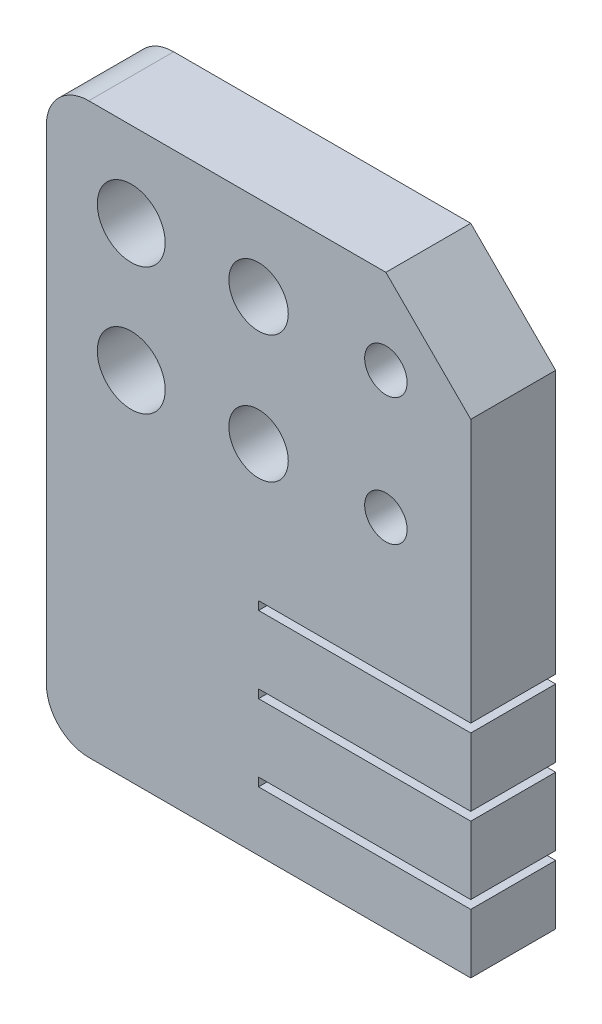
ISO-10303-21;
HEADER;
FILE_DESCRIPTION(('STEP AP214'),'2;1');
FILE_NAME('part.step','',(''),(''),'','','');
FILE_SCHEMA(('AUTOMOTIVE_DESIGN { 1 0 10303 214 1 1 1 1 }'));
ENDSEC;
DATA;
#1=APPLICATION_CONTEXT('core data for automotive mechanical design processes');
#2=APPLICATION_PROTOCOL_DEFINITION('international standard','automotive_design',2000,#1);
#3=PRODUCT_CONTEXT('',#1,'mechanical');
#4=PRODUCT('Part','Part','',(#3));
#5=PRODUCT_RELATED_PRODUCT_CATEGORY('part','',(#4));
#6=PRODUCT_DEFINITION_FORMATION('','',#4);
#7=PRODUCT_DEFINITION_CONTEXT('part definition',#1,'design');
#8=PRODUCT_DEFINITION('design','',#6,#7);
#9=PRODUCT_DEFINITION_SHAPE('','',#8);
#10=(LENGTH_UNIT() NAMED_UNIT(*) SI_UNIT(.MILLI.,.METRE.));
#11=(NAMED_UNIT(*) PLANE_ANGLE_UNIT() SI_UNIT($,.RADIAN.));
#12=(NAMED_UNIT(*) SI_UNIT($,.STERADIAN.) SOLID_ANGLE_UNIT());
#13=UNCERTAINTY_MEASURE_WITH_UNIT(LENGTH_MEASURE(1.E-05),#10,'distance_accuracy_value','');
#14=(GEOMETRIC_REPRESENTATION_CONTEXT(3) GLOBAL_UNCERTAINTY_ASSIGNED_CONTEXT((#13)) GLOBAL_UNIT_ASSIGNED_CONTEXT((#10,
#11,#12)) REPRESENTATION_CONTEXT('',''));
#15=CARTESIAN_POINT('',(0.,0.,0.));
#16=DIRECTION('',(0.,0.,1.));
#17=DIRECTION('',(1.,0.,0.));
#18=AXIS2_PLACEMENT_3D('',#15,#16,#17);
#19=CARTESIAN_POINT('',(50.,0.,10.));
#20=DIRECTION('',(-1.,0.,0.));
#21=DIRECTION('',(0.,0.,1.));
#22=AXIS2_PLACEMENT_3D('',#19,#20,#21);
#23=PLANE('',#22);
#24=DIRECTION('',(0.,1.,0.));
#25=VECTOR('',#24,1.);
#26=CARTESIAN_POINT('',(50.,0.,10.));
#27=LINE('',#26,#25);
#28=CARTESIAN_POINT('',(50.,26.,10.));
#29=VERTEX_POINT('',#28);
#30=CARTESIAN_POINT('',(50.,57.,10.));
#31=VERTEX_POINT('',#30);
#32=EDGE_CURVE('E340',#29,#31,#27,.T.);
#33=ORIENTED_EDGE('',*,*,#32,.F.);
#34=DIRECTION('',(0.,0.,1.));
#35=VECTOR('',#34,1.);
#36=CARTESIAN_POINT('',(50.,26.,-25.0199920063936));
#37=LINE('',#36,#35);
#38=CARTESIAN_POINT('',(50.,26.,0.));
#39=VERTEX_POINT('',#38);
#40=EDGE_CURVE('E211',#39,#29,#37,.T.);
#41=ORIENTED_EDGE('',*,*,#40,.F.);
#42=DIRECTION('',(0.,1.,0.));
#43=VECTOR('',#42,1.);
#44=CARTESIAN_POINT('',(50.,0.,0.));
#45=LINE('',#44,#43);
#46=CARTESIAN_POINT('',(50.,57.,0.));
#47=VERTEX_POINT('',#46);
#48=EDGE_CURVE('E196',#39,#47,#45,.T.);
#49=ORIENTED_EDGE('',*,*,#48,.T.);
#50=DIRECTION('',(0.,0.,-1.));
#51=VECTOR('',#50,1.);
#52=CARTESIAN_POINT('',(50.,57.,10.));
#53=LINE('',#52,#51);
#54=EDGE_CURVE('E11',#31,#47,#53,.T.);
#55=ORIENTED_EDGE('',*,*,#54,.F.);
#56=EDGE_LOOP('',(#33,#41,#49,#55));
#57=FACE_BOUND('',#56,.T.);
#58=ADVANCED_FACE('F39',(#57),#23,.F.);
#59=CARTESIAN_POINT('',(50.,17.,0.));
#60=VERTEX_POINT('',#59);
#61=CARTESIAN_POINT('',(50.,25.,0.));
#62=VERTEX_POINT('',#61);
#63=EDGE_CURVE('E431',#60,#62,#45,.T.);
#64=ORIENTED_EDGE('',*,*,#63,.T.);
#65=DIRECTION('',(0.,0.,1.));
#66=VECTOR('',#65,1.);
#67=CARTESIAN_POINT('',(50.,25.,-25.0199920063936));
#68=LINE('',#67,#66);
#69=CARTESIAN_POINT('',(50.,25.,10.));
#70=VERTEX_POINT('',#69);
#71=EDGE_CURVE('E207',#62,#70,#68,.T.);
#72=ORIENTED_EDGE('',*,*,#71,.T.);
#73=CARTESIAN_POINT('',(50.,17.,10.));
#74=VERTEX_POINT('',#73);
#75=EDGE_CURVE('E455',#74,#70,#27,.T.);
#76=ORIENTED_EDGE('',*,*,#75,.F.);
#77=DIRECTION('',(0.,0.,1.));
#78=VECTOR('',#77,1.);
#79=CARTESIAN_POINT('',(50.,17.,-25.0199920063936));
#80=LINE('',#79,#78);
#81=EDGE_CURVE('E245',#60,#74,#80,.T.);
#82=ORIENTED_EDGE('',*,*,#81,.F.);
#83=EDGE_LOOP('',(#64,#72,#76,#82));
#84=FACE_BOUND('',#83,.T.);
#85=ADVANCED_FACE('F460',(#84),#23,.F.);
#86=CARTESIAN_POINT('',(50.,8.,0.));
#87=VERTEX_POINT('',#86);
#88=CARTESIAN_POINT('',(50.,16.,0.));
#89=VERTEX_POINT('',#88);
#90=EDGE_CURVE('E364',#87,#89,#45,.T.);
#91=ORIENTED_EDGE('',*,*,#90,.T.);
#92=DIRECTION('',(0.,0.,1.));
#93=VECTOR('',#92,1.);
#94=CARTESIAN_POINT('',(50.,16.,-25.0199920063936));
#95=LINE('',#94,#93);
#96=CARTESIAN_POINT('',(50.,16.,10.));
#97=VERTEX_POINT('',#96);
#98=EDGE_CURVE('E237',#89,#97,#95,.T.);
#99=ORIENTED_EDGE('',*,*,#98,.T.);
#100=CARTESIAN_POINT('',(50.,8.,10.));
#101=VERTEX_POINT('',#100);
#102=EDGE_CURVE('E339',#101,#97,#27,.T.);
#103=ORIENTED_EDGE('',*,*,#102,.F.);
#104=DIRECTION('',(0.,0.,1.));
#105=VECTOR('',#104,1.);
#106=CARTESIAN_POINT('',(50.,8.,-25.0199920063936));
#107=LINE('',#106,#105);
#108=EDGE_CURVE('E228',#87,#101,#107,.T.);
#109=ORIENTED_EDGE('',*,*,#108,.F.);
#110=EDGE_LOOP('',(#91,#99,#103,#109));
#111=FACE_BOUND('',#110,.T.);
#112=ADVANCED_FACE('F442',(#111),#23,.F.);
#113=CARTESIAN_POINT('',(5.,62.,10.));
#114=DIRECTION('',(0.,0.,-1.));
#115=DIRECTION('',(-1.,0.,0.));
#116=AXIS2_PLACEMENT_3D('',#113,#114,#115);
#117=PLANE('',#116);
#118=DIRECTION('',(0.,-1.,0.));
#119=VECTOR('',#118,1.);
#120=CARTESIAN_POINT('',(25.,26.,10.));
#121=LINE('',#120,#119);
#122=CARTESIAN_POINT('',(25.,26.,10.));
#123=VERTEX_POINT('',#122);
#124=CARTESIAN_POINT('',(25.,25.,10.));
#125=VERTEX_POINT('',#124);
#126=EDGE_CURVE('E200',#123,#125,#121,.T.);
#127=ORIENTED_EDGE('',*,*,#126,.F.);
#128=DIRECTION('',(-1.,0.,0.));
#129=VECTOR('',#128,1.);
#130=CARTESIAN_POINT('',(50.,26.,10.));
#131=LINE('',#130,#129);
#132=EDGE_CURVE('E188',#29,#123,#131,.T.);
#133=ORIENTED_EDGE('',*,*,#132,.F.);
#134=ORIENTED_EDGE('',*,*,#32,.T.);
#135=DIRECTION('',(-0.707106781186549,0.707106781186546,0.));
#136=VECTOR('',#135,1.);
#137=CARTESIAN_POINT('',(40.,67.,10.));
#138=LINE('',#137,#136);
#139=CARTESIAN_POINT('',(40.,67.,10.));
#140=VERTEX_POINT('',#139);
#141=EDGE_CURVE('E338',#31,#140,#138,.T.);
#142=ORIENTED_EDGE('',*,*,#141,.T.);
#143=DIRECTION('',(-1.,0.,0.));
#144=VECTOR('',#143,1.);
#145=CARTESIAN_POINT('',(5.00000000000004,67.,10.));
#146=LINE('',#145,#144);
#147=CARTESIAN_POINT('',(5.00000000000003,67.,10.));
#148=VERTEX_POINT('',#147);
#149=EDGE_CURVE('E343',#140,#148,#146,.T.);
#150=ORIENTED_EDGE('',*,*,#149,.T.);
#151=CARTESIAN_POINT('',(5.,62.,10.));
#152=DIRECTION('',(0.,0.,1.));
#153=DIRECTION('',(-1.,0.,0.));
#154=AXIS2_PLACEMENT_3D('',#151,#152,#153);
#155=CIRCLE('',#154,5.);
#156=CARTESIAN_POINT('',(0.,62.,10.));
#157=VERTEX_POINT('',#156);
#158=EDGE_CURVE('E346',#148,#157,#155,.T.);
#159=ORIENTED_EDGE('',*,*,#158,.T.);
#160=DIRECTION('',(0.,-1.,0.));
#161=VECTOR('',#160,1.);
#162=CARTESIAN_POINT('',(0.,5.00000000000004,10.));
#163=LINE('',#162,#161);
#164=CARTESIAN_POINT('',(0.,5.,10.));
#165=VERTEX_POINT('',#164);
#166=EDGE_CURVE('E349',#157,#165,#163,.T.);
#167=ORIENTED_EDGE('',*,*,#166,.T.);
#168=CARTESIAN_POINT('',(5.,5.,10.));
#169=DIRECTION('',(0.,0.,1.));
#170=DIRECTION('',(-1.,0.,0.));
#171=AXIS2_PLACEMENT_3D('',#168,#169,#170);
#172=CIRCLE('',#171,5.);
#173=CARTESIAN_POINT('',(5.00000000000004,0.,10.));
#174=VERTEX_POINT('',#173);
#175=EDGE_CURVE('E352',#165,#174,#172,.T.);
#176=ORIENTED_EDGE('',*,*,#175,.T.);
#177=DIRECTION('',(1.,0.,0.));
#178=VECTOR('',#177,1.);
#179=CARTESIAN_POINT('',(5.00000000000004,0.,10.));
#180=LINE('',#179,#178);
#181=CARTESIAN_POINT('',(50.,0.,10.));
#182=VERTEX_POINT('',#181);
#183=EDGE_CURVE('E355',#174,#182,#180,.T.);
#184=ORIENTED_EDGE('',*,*,#183,.T.);
#185=CARTESIAN_POINT('',(50.,7.,10.));
#186=VERTEX_POINT('',#185);
#187=EDGE_CURVE('E334',#182,#186,#27,.T.);
#188=ORIENTED_EDGE('',*,*,#187,.T.);
#189=DIRECTION('',(1.,0.,0.));
#190=VECTOR('',#189,1.);
#191=CARTESIAN_POINT('',(25.,7.,10.));
#192=LINE('',#191,#190);
#193=CARTESIAN_POINT('',(25.,7.,10.));
#194=VERTEX_POINT('',#193);
#195=EDGE_CURVE('E252',#194,#186,#192,.T.);
#196=ORIENTED_EDGE('',*,*,#195,.F.);
#197=DIRECTION('',(0.,-1.,0.));
#198=VECTOR('',#197,1.);
#199=CARTESIAN_POINT('',(25.,8.,10.));
#200=LINE('',#199,#198);
#201=CARTESIAN_POINT('',(25.,8.,10.));
#202=VERTEX_POINT('',#201);
#203=EDGE_CURVE('E256',#202,#194,#200,.T.);
#204=ORIENTED_EDGE('',*,*,#203,.F.);
#205=DIRECTION('',(-1.,0.,0.));
#206=VECTOR('',#205,1.);
#207=CARTESIAN_POINT('',(50.,8.,10.));
#208=LINE('',#207,#206);
#209=EDGE_CURVE('E260',#101,#202,#208,.T.);
#210=ORIENTED_EDGE('',*,*,#209,.F.);
#211=ORIENTED_EDGE('',*,*,#102,.T.);
#212=DIRECTION('',(1.,0.,0.));
#213=VECTOR('',#212,1.);
#214=CARTESIAN_POINT('',(25.,16.,10.));
#215=LINE('',#214,#213);
#216=CARTESIAN_POINT('',(25.,16.,10.));
#217=VERTEX_POINT('',#216);
#218=EDGE_CURVE('E63',#217,#97,#215,.T.);
#219=ORIENTED_EDGE('',*,*,#218,.F.);
#220=DIRECTION('',(0.,-1.,0.));
#221=VECTOR('',#220,1.);
#222=CARTESIAN_POINT('',(25.,17.,10.));
#223=LINE('',#222,#221);
#224=CARTESIAN_POINT('',(25.,17.,10.));
#225=VERTEX_POINT('',#224);
#226=EDGE_CURVE('E220',#225,#217,#223,.T.);
#227=ORIENTED_EDGE('',*,*,#226,.F.);
#228=DIRECTION('',(-1.,0.,0.));
#229=VECTOR('',#228,1.);
#230=CARTESIAN_POINT('',(50.,17.,10.));
#231=LINE('',#230,#229);
#232=EDGE_CURVE('E224',#74,#225,#231,.T.);
#233=ORIENTED_EDGE('',*,*,#232,.F.);
#234=ORIENTED_EDGE('',*,*,#75,.T.);
#235=DIRECTION('',(1.,0.,0.));
#236=VECTOR('',#235,1.);
#237=CARTESIAN_POINT('',(25.,25.,10.));
#238=LINE('',#237,#236);
#239=EDGE_CURVE('E55',#125,#70,#238,.T.);
#240=ORIENTED_EDGE('',*,*,#239,.F.);
#241=EDGE_LOOP('',(#127,#133,#134,#142,#150,#159,#167,#176,#184,#188,#196,#204,#210,#211,#219,
#227,#233,#234,#240));
#242=FACE_BOUND('',#241,.T.);
#243=CARTESIAN_POINT('',(10.,57.,10.));
#244=DIRECTION('',(0.,0.,1.));
#245=DIRECTION('',(1.,0.,0.));
#246=AXIS2_PLACEMENT_3D('',#243,#244,#245);
#247=CIRCLE('',#246,4.);
#248=CARTESIAN_POINT('',(14.,57.,10.));
#249=VERTEX_POINT('',#248);
#250=EDGE_CURVE('E327',#249,#249,#247,.T.);
#251=ORIENTED_EDGE('',*,*,#250,.F.);
#252=EDGE_LOOP('',(#251));
#253=FACE_BOUND('',#252,.T.);
#254=CARTESIAN_POINT('',(25.,57.,10.));
#255=DIRECTION('',(0.,0.,1.));
#256=DIRECTION('',(1.,0.,0.));
#257=AXIS2_PLACEMENT_3D('',#254,#255,#256);
#258=CIRCLE('',#257,3.5);
#259=CARTESIAN_POINT('',(28.5,57.,10.));
#260=VERTEX_POINT('',#259);
#261=EDGE_CURVE('E319',#260,#260,#258,.T.);
#262=ORIENTED_EDGE('',*,*,#261,.F.);
#263=EDGE_LOOP('',(#262));
#264=FACE_BOUND('',#263,.T.);
#265=CARTESIAN_POINT('',(40.,57.,10.));
#266=DIRECTION('',(0.,0.,1.));
#267=DIRECTION('',(1.,0.,0.));
#268=AXIS2_PLACEMENT_3D('',#265,#266,#267);
#269=CIRCLE('',#268,2.5);
#270=CARTESIAN_POINT('',(42.5,57.,10.));
#271=VERTEX_POINT('',#270);
#272=EDGE_CURVE('E311',#271,#271,#269,.T.);
#273=ORIENTED_EDGE('',*,*,#272,.F.);
#274=EDGE_LOOP('',(#273));
#275=FACE_BOUND('',#274,.T.);
#276=CARTESIAN_POINT('',(10.,42.,10.));
#277=DIRECTION('',(0.,0.,1.));
#278=DIRECTION('',(1.,0.,0.));
#279=AXIS2_PLACEMENT_3D('',#276,#277,#278);
#280=CIRCLE('',#279,4.);
#281=CARTESIAN_POINT('',(14.,42.,10.));
#282=VERTEX_POINT('',#281);
#283=EDGE_CURVE('E303',#282,#282,#280,.T.);
#284=ORIENTED_EDGE('',*,*,#283,.F.);
#285=EDGE_LOOP('',(#284));
#286=FACE_BOUND('',#285,.T.);
#287=CARTESIAN_POINT('',(25.,42.,10.));
#288=DIRECTION('',(0.,0.,1.));
#289=DIRECTION('',(1.,0.,0.));
#290=AXIS2_PLACEMENT_3D('',#287,#288,#289);
#291=CIRCLE('',#290,3.5);
#292=CARTESIAN_POINT('',(28.5,42.,10.));
#293=VERTEX_POINT('',#292);
#294=EDGE_CURVE('E295',#293,#293,#291,.T.);
#295=ORIENTED_EDGE('',*,*,#294,.F.);
#296=EDGE_LOOP('',(#295));
#297=FACE_BOUND('',#296,.T.);
#298=CARTESIAN_POINT('',(40.,42.,10.));
#299=DIRECTION('',(0.,0.,1.));
#300=DIRECTION('',(1.,0.,0.));
#301=AXIS2_PLACEMENT_3D('',#298,#299,#300);
#302=CIRCLE('',#301,2.5);
#303=CARTESIAN_POINT('',(42.5,42.,10.));
#304=VERTEX_POINT('',#303);
#305=EDGE_CURVE('E287',#304,#304,#302,.T.);
#306=ORIENTED_EDGE('',*,*,#305,.F.);
#307=EDGE_LOOP('',(#306));
#308=FACE_BOUND('',#307,.T.);
#309=ADVANCED_FACE('F423',(#242,#253,#264,#275,#286,#297,#308),#117,.F.);
#310=CARTESIAN_POINT('',(5.,62.,0.));
#311=DIRECTION('',(0.,0.,-1.));
#312=DIRECTION('',(-1.,0.,0.));
#313=AXIS2_PLACEMENT_3D('',#310,#311,#312);
#314=PLANE('',#313);
#315=DIRECTION('',(-1.,0.,0.));
#316=VECTOR('',#315,1.);
#317=CARTESIAN_POINT('',(50.,26.,0.));
#318=LINE('',#317,#316);
#319=CARTESIAN_POINT('',(25.,26.,0.));
#320=VERTEX_POINT('',#319);
#321=EDGE_CURVE('E185',#39,#320,#318,.T.);
#322=ORIENTED_EDGE('',*,*,#321,.T.);
#323=DIRECTION('',(0.,-1.,0.));
#324=VECTOR('',#323,1.);
#325=CARTESIAN_POINT('',(25.,26.,0.));
#326=LINE('',#325,#324);
#327=CARTESIAN_POINT('',(25.,25.,0.));
#328=VERTEX_POINT('',#327);
#329=EDGE_CURVE('E171',#320,#328,#326,.T.);
#330=ORIENTED_EDGE('',*,*,#329,.T.);
#331=DIRECTION('',(1.,0.,0.));
#332=VECTOR('',#331,1.);
#333=CARTESIAN_POINT('',(25.,25.,0.));
#334=LINE('',#333,#332);
#335=EDGE_CURVE('E205',#328,#62,#334,.T.);
#336=ORIENTED_EDGE('',*,*,#335,.T.);
#337=ORIENTED_EDGE('',*,*,#63,.F.);
#338=DIRECTION('',(-1.,0.,0.));
#339=VECTOR('',#338,1.);
#340=CARTESIAN_POINT('',(50.,17.,0.));
#341=LINE('',#340,#339);
#342=CARTESIAN_POINT('',(25.,17.,0.));
#343=VERTEX_POINT('',#342);
#344=EDGE_CURVE('E219',#60,#343,#341,.T.);
#345=ORIENTED_EDGE('',*,*,#344,.T.);
#346=DIRECTION('',(0.,-1.,0.));
#347=VECTOR('',#346,1.);
#348=CARTESIAN_POINT('',(25.,17.,0.));
#349=LINE('',#348,#347);
#350=CARTESIAN_POINT('',(25.,16.,0.));
#351=VERTEX_POINT('',#350);
#352=EDGE_CURVE('E239',#343,#351,#349,.T.);
#353=ORIENTED_EDGE('',*,*,#352,.T.);
#354=DIRECTION('',(1.,0.,0.));
#355=VECTOR('',#354,1.);
#356=CARTESIAN_POINT('',(25.,16.,0.));
#357=LINE('',#356,#355);
#358=EDGE_CURVE('E233',#351,#89,#357,.T.);
#359=ORIENTED_EDGE('',*,*,#358,.T.);
#360=ORIENTED_EDGE('',*,*,#90,.F.);
#361=DIRECTION('',(-1.,0.,0.));
#362=VECTOR('',#361,1.);
#363=CARTESIAN_POINT('',(50.,8.,0.));
#364=LINE('',#363,#362);
#365=CARTESIAN_POINT('',(25.,8.,0.));
#366=VERTEX_POINT('',#365);
#367=EDGE_CURVE('E255',#87,#366,#364,.T.);
#368=ORIENTED_EDGE('',*,*,#367,.T.);
#369=DIRECTION('',(0.,-1.,0.));
#370=VECTOR('',#369,1.);
#371=CARTESIAN_POINT('',(25.,8.,0.));
#372=LINE('',#371,#370);
#373=CARTESIAN_POINT('',(25.,7.,0.));
#374=VERTEX_POINT('',#373);
#375=EDGE_CURVE('E274',#366,#374,#372,.T.);
#376=ORIENTED_EDGE('',*,*,#375,.T.);
#377=DIRECTION('',(1.,0.,0.));
#378=VECTOR('',#377,1.);
#379=CARTESIAN_POINT('',(25.,7.,0.));
#380=LINE('',#379,#378);
#381=CARTESIAN_POINT('',(50.,7.,0.));
#382=VERTEX_POINT('',#381);
#383=EDGE_CURVE('E268',#374,#382,#380,.T.);
#384=ORIENTED_EDGE('',*,*,#383,.T.);
#385=CARTESIAN_POINT('',(50.,0.,0.));
#386=VERTEX_POINT('',#385);
#387=EDGE_CURVE('E359',#386,#382,#45,.T.);
#388=ORIENTED_EDGE('',*,*,#387,.F.);
#389=DIRECTION('',(1.,0.,0.));
#390=VECTOR('',#389,1.);
#391=CARTESIAN_POINT('',(5.00000000000004,0.,0.));
#392=LINE('',#391,#390);
#393=CARTESIAN_POINT('',(5.00000000000004,0.,0.));
#394=VERTEX_POINT('',#393);
#395=EDGE_CURVE('E379',#394,#386,#392,.T.);
#396=ORIENTED_EDGE('',*,*,#395,.F.);
#397=CARTESIAN_POINT('',(5.,5.,0.));
#398=DIRECTION('',(0.,0.,1.));
#399=DIRECTION('',(-1.,0.,0.));
#400=AXIS2_PLACEMENT_3D('',#397,#398,#399);
#401=CIRCLE('',#400,5.);
#402=CARTESIAN_POINT('',(0.,5.,0.));
#403=VERTEX_POINT('',#402);
#404=EDGE_CURVE('E376',#403,#394,#401,.T.);
#405=ORIENTED_EDGE('',*,*,#404,.F.);
#406=DIRECTION('',(0.,-1.,0.));
#407=VECTOR('',#406,1.);
#408=CARTESIAN_POINT('',(0.,5.00000000000004,0.));
#409=LINE('',#408,#407);
#410=CARTESIAN_POINT('',(0.,62.,0.));
#411=VERTEX_POINT('',#410);
#412=EDGE_CURVE('E373',#411,#403,#409,.T.);
#413=ORIENTED_EDGE('',*,*,#412,.F.);
#414=CARTESIAN_POINT('',(5.,62.,0.));
#415=DIRECTION('',(0.,0.,1.));
#416=DIRECTION('',(-1.,0.,0.));
#417=AXIS2_PLACEMENT_3D('',#414,#415,#416);
#418=CIRCLE('',#417,5.);
#419=CARTESIAN_POINT('',(5.00000000000003,67.,0.));
#420=VERTEX_POINT('',#419);
#421=EDGE_CURVE('E370',#420,#411,#418,.T.);
#422=ORIENTED_EDGE('',*,*,#421,.F.);
#423=DIRECTION('',(-1.,0.,0.));
#424=VECTOR('',#423,1.);
#425=CARTESIAN_POINT('',(5.00000000000004,67.,0.));
#426=LINE('',#425,#424);
#427=CARTESIAN_POINT('',(40.,67.,0.));
#428=VERTEX_POINT('',#427);
#429=EDGE_CURVE('E367',#428,#420,#426,.T.);
#430=ORIENTED_EDGE('',*,*,#429,.F.);
#431=DIRECTION('',(-0.707106781186549,0.707106781186546,0.));
#432=VECTOR('',#431,1.);
#433=CARTESIAN_POINT('',(40.,67.,0.));
#434=LINE('',#433,#432);
#435=EDGE_CURVE('E363',#47,#428,#434,.T.);
#436=ORIENTED_EDGE('',*,*,#435,.F.);
#437=ORIENTED_EDGE('',*,*,#48,.F.);
#438=EDGE_LOOP('',(#322,#330,#336,#337,#345,#353,#359,#360,#368,#376,#384,#388,#396,#405,#413,
#422,#430,#436,#437));
#439=FACE_BOUND('',#438,.T.);
#440=CARTESIAN_POINT('',(25.,42.,0.));
#441=DIRECTION('',(0.,0.,1.));
#442=DIRECTION('',(1.,0.,0.));
#443=AXIS2_PLACEMENT_3D('',#440,#441,#442);
#444=CIRCLE('',#443,3.5);
#445=CARTESIAN_POINT('',(28.5,42.,0.));
#446=VERTEX_POINT('',#445);
#447=EDGE_CURVE('E291',#446,#446,#444,.T.);
#448=ORIENTED_EDGE('',*,*,#447,.T.);
#449=EDGE_LOOP('',(#448));
#450=FACE_BOUND('',#449,.T.);
#451=CARTESIAN_POINT('',(40.,57.,0.));
#452=DIRECTION('',(0.,0.,1.));
#453=DIRECTION('',(1.,0.,0.));
#454=AXIS2_PLACEMENT_3D('',#451,#452,#453);
#455=CIRCLE('',#454,2.5);
#456=CARTESIAN_POINT('',(42.5,57.,0.));
#457=VERTEX_POINT('',#456);
#458=EDGE_CURVE('E307',#457,#457,#455,.T.);
#459=ORIENTED_EDGE('',*,*,#458,.T.);
#460=EDGE_LOOP('',(#459));
#461=FACE_BOUND('',#460,.T.);
#462=CARTESIAN_POINT('',(10.,57.,0.));
#463=DIRECTION('',(0.,0.,1.));
#464=DIRECTION('',(1.,0.,0.));
#465=AXIS2_PLACEMENT_3D('',#462,#463,#464);
#466=CIRCLE('',#465,4.);
#467=CARTESIAN_POINT('',(14.,57.,0.));
#468=VERTEX_POINT('',#467);
#469=EDGE_CURVE('E323',#468,#468,#466,.T.);
#470=ORIENTED_EDGE('',*,*,#469,.T.);
#471=EDGE_LOOP('',(#470));
#472=FACE_BOUND('',#471,.T.);
#473=CARTESIAN_POINT('',(25.,57.,0.));
#474=DIRECTION('',(0.,0.,1.));
#475=DIRECTION('',(1.,0.,0.));
#476=AXIS2_PLACEMENT_3D('',#473,#474,#475);
#477=CIRCLE('',#476,3.5);
#478=CARTESIAN_POINT('',(28.5,57.,0.));
#479=VERTEX_POINT('',#478);
#480=EDGE_CURVE('E315',#479,#479,#477,.T.);
#481=ORIENTED_EDGE('',*,*,#480,.T.);
#482=EDGE_LOOP('',(#481));
#483=FACE_BOUND('',#482,.T.);
#484=CARTESIAN_POINT('',(10.,42.,0.));
#485=DIRECTION('',(0.,0.,1.));
#486=DIRECTION('',(1.,0.,0.));
#487=AXIS2_PLACEMENT_3D('',#484,#485,#486);
#488=CIRCLE('',#487,4.);
#489=CARTESIAN_POINT('',(14.,42.,0.));
#490=VERTEX_POINT('',#489);
#491=EDGE_CURVE('E299',#490,#490,#488,.T.);
#492=ORIENTED_EDGE('',*,*,#491,.T.);
#493=EDGE_LOOP('',(#492));
#494=FACE_BOUND('',#493,.T.);
#495=CARTESIAN_POINT('',(40.,42.,0.));
#496=DIRECTION('',(0.,0.,1.));
#497=DIRECTION('',(1.,0.,0.));
#498=AXIS2_PLACEMENT_3D('',#495,#496,#497);
#499=CIRCLE('',#498,2.5);
#500=CARTESIAN_POINT('',(42.5,42.,0.));
#501=VERTEX_POINT('',#500);
#502=EDGE_CURVE('E216',#501,#501,#499,.T.);
#503=ORIENTED_EDGE('',*,*,#502,.T.);
#504=EDGE_LOOP('',(#503));
#505=FACE_BOUND('',#504,.T.);
#506=ADVANCED_FACE('F193',(#439,#450,#461,#472,#483,#494,#505),#314,.T.);
#507=ORIENTED_EDGE('',*,*,#387,.T.);
#508=DIRECTION('',(0.,0.,1.));
#509=VECTOR('',#508,1.);
#510=CARTESIAN_POINT('',(50.,7.,-25.0199920063936));
#511=LINE('',#510,#509);
#512=EDGE_CURVE('E272',#382,#186,#511,.T.);
#513=ORIENTED_EDGE('',*,*,#512,.T.);
#514=ORIENTED_EDGE('',*,*,#187,.F.);
#515=DIRECTION('',(0.,0.,-1.));
#516=VECTOR('',#515,1.);
#517=CARTESIAN_POINT('',(50.,0.,10.));
#518=LINE('',#517,#516);
#519=EDGE_CURVE('E358',#182,#386,#518,.T.);
#520=ORIENTED_EDGE('',*,*,#519,.T.);
#521=EDGE_LOOP('',(#507,#513,#514,#520));
#522=FACE_BOUND('',#521,.T.);
#523=ADVANCED_FACE('F41',(#522),#23,.F.);
#524=CARTESIAN_POINT('',(40.,67.,10.));
#525=DIRECTION('',(-0.707106781186546,-0.707106781186549,0.));
#526=DIRECTION('',(0.707106781186549,-0.707106781186546,0.));
#527=AXIS2_PLACEMENT_3D('',#524,#525,#526);
#528=PLANE('',#527);
#529=ORIENTED_EDGE('',*,*,#435,.T.);
#530=DIRECTION('',(0.,0.,-1.));
#531=VECTOR('',#530,1.);
#532=CARTESIAN_POINT('',(40.,67.,10.));
#533=LINE('',#532,#531);
#534=EDGE_CURVE('E48',#140,#428,#533,.T.);
#535=ORIENTED_EDGE('',*,*,#534,.F.);
#536=ORIENTED_EDGE('',*,*,#141,.F.);
#537=ORIENTED_EDGE('',*,*,#54,.T.);
#538=EDGE_LOOP('',(#529,#535,#536,#537));
#539=FACE_BOUND('',#538,.T.);
#540=ADVANCED_FACE('F428',(#539),#528,.F.);
#541=CARTESIAN_POINT('',(5.00000000000004,67.,10.));
#542=DIRECTION('',(0.,-1.,0.));
#543=DIRECTION('',(0.,0.,-1.));
#544=AXIS2_PLACEMENT_3D('',#541,#542,#543);
#545=PLANE('',#544);
#546=ORIENTED_EDGE('',*,*,#429,.T.);
#547=DIRECTION('',(0.,0.,-1.));
#548=VECTOR('',#547,1.);
#549=CARTESIAN_POINT('',(5.00000000000003,67.,10.));
#550=LINE('',#549,#548);
#551=EDGE_CURVE('E397',#148,#420,#550,.T.);
#552=ORIENTED_EDGE('',*,*,#551,.F.);
#553=ORIENTED_EDGE('',*,*,#149,.F.);
#554=ORIENTED_EDGE('',*,*,#534,.T.);
#555=EDGE_LOOP('',(#546,#552,#553,#554));
#556=FACE_BOUND('',#555,.T.);
#557=ADVANCED_FACE('F406',(#556),#545,.F.);
#558=CARTESIAN_POINT('',(5.,62.,10.));
#559=DIRECTION('',(0.,0.,-1.));
#560=DIRECTION('',(-1.,0.,0.));
#561=AXIS2_PLACEMENT_3D('',#558,#559,#560);
#562=CYLINDRICAL_SURFACE('',#561,5.);
#563=ORIENTED_EDGE('',*,*,#421,.T.);
#564=DIRECTION('',(0.,0.,-1.));
#565=VECTOR('',#564,1.);
#566=CARTESIAN_POINT('',(0.,62.,10.));
#567=LINE('',#566,#565);
#568=EDGE_CURVE('E393',#157,#411,#567,.T.);
#569=ORIENTED_EDGE('',*,*,#568,.F.);
#570=ORIENTED_EDGE('',*,*,#158,.F.);
#571=ORIENTED_EDGE('',*,*,#551,.T.);
#572=EDGE_LOOP('',(#563,#569,#570,#571));
#573=FACE_BOUND('',#572,.T.);
#574=ADVANCED_FACE('F415',(#573),#562,.T.);
#575=CARTESIAN_POINT('',(0.,5.00000000000004,10.));
#576=DIRECTION('',(1.,0.,0.));
#577=DIRECTION('',(0.,0.,-1.));
#578=AXIS2_PLACEMENT_3D('',#575,#576,#577);
#579=PLANE('',#578);
#580=ORIENTED_EDGE('',*,*,#412,.T.);
#581=DIRECTION('',(0.,0.,-1.));
#582=VECTOR('',#581,1.);
#583=CARTESIAN_POINT('',(0.,5.,10.));
#584=LINE('',#583,#582);
#585=EDGE_CURVE('E389',#165,#403,#584,.T.);
#586=ORIENTED_EDGE('',*,*,#585,.F.);
#587=ORIENTED_EDGE('',*,*,#166,.F.);
#588=ORIENTED_EDGE('',*,*,#568,.T.);
#589=EDGE_LOOP('',(#580,#586,#587,#588));
#590=FACE_BOUND('',#589,.T.);
#591=ADVANCED_FACE('F419',(#590),#579,.F.);
#592=CARTESIAN_POINT('',(5.,5.,10.));
#593=DIRECTION('',(0.,0.,-1.));
#594=DIRECTION('',(-1.,0.,0.));
#595=AXIS2_PLACEMENT_3D('',#592,#593,#594);
#596=CYLINDRICAL_SURFACE('',#595,5.);
#597=ORIENTED_EDGE('',*,*,#404,.T.);
#598=DIRECTION('',(0.,0.,-1.));
#599=VECTOR('',#598,1.);
#600=CARTESIAN_POINT('',(5.00000000000004,0.,10.));
#601=LINE('',#600,#599);
#602=EDGE_CURVE('E385',#174,#394,#601,.T.);
#603=ORIENTED_EDGE('',*,*,#602,.F.);
#604=ORIENTED_EDGE('',*,*,#175,.F.);
#605=ORIENTED_EDGE('',*,*,#585,.T.);
#606=EDGE_LOOP('',(#597,#603,#604,#605));
#607=FACE_BOUND('',#606,.T.);
#608=ADVANCED_FACE('F500',(#607),#596,.T.);
#609=CARTESIAN_POINT('',(5.00000000000004,0.,10.));
#610=DIRECTION('',(0.,1.,0.));
#611=DIRECTION('',(0.,0.,1.));
#612=AXIS2_PLACEMENT_3D('',#609,#610,#611);
#613=PLANE('',#612);
#614=ORIENTED_EDGE('',*,*,#395,.T.);
#615=ORIENTED_EDGE('',*,*,#519,.F.);
#616=ORIENTED_EDGE('',*,*,#183,.F.);
#617=ORIENTED_EDGE('',*,*,#602,.T.);
#618=EDGE_LOOP('',(#614,#615,#616,#617));
#619=FACE_BOUND('',#618,.T.);
#620=ADVANCED_FACE('F497',(#619),#613,.F.);
#621=CARTESIAN_POINT('',(10.,57.,10.));
#622=DIRECTION('',(0.,0.,-1.));
#623=DIRECTION('',(-1.,0.,0.));
#624=AXIS2_PLACEMENT_3D('',#621,#622,#623);
#625=CYLINDRICAL_SURFACE('',#624,4.);
#626=ORIENTED_EDGE('',*,*,#250,.T.);
#627=EDGE_LOOP('',(#626));
#628=FACE_BOUND('',#627,.T.);
#629=ORIENTED_EDGE('',*,*,#469,.F.);
#630=EDGE_LOOP('',(#629));
#631=FACE_BOUND('',#630,.T.);
#632=ADVANCED_FACE('F494',(#628,#631),#625,.F.);
#633=CARTESIAN_POINT('',(25.,57.,10.));
#634=DIRECTION('',(0.,0.,-1.));
#635=DIRECTION('',(-1.,0.,0.));
#636=AXIS2_PLACEMENT_3D('',#633,#634,#635);
#637=CYLINDRICAL_SURFACE('',#636,3.5);
#638=ORIENTED_EDGE('',*,*,#261,.T.);
#639=EDGE_LOOP('',(#638));
#640=FACE_BOUND('',#639,.T.);
#641=ORIENTED_EDGE('',*,*,#480,.F.);
#642=EDGE_LOOP('',(#641));
#643=FACE_BOUND('',#642,.T.);
#644=ADVANCED_FACE('F536',(#640,#643),#637,.F.);
#645=CARTESIAN_POINT('',(40.,57.,10.));
#646=DIRECTION('',(0.,0.,-1.));
#647=DIRECTION('',(-1.,0.,0.));
#648=AXIS2_PLACEMENT_3D('',#645,#646,#647);
#649=CYLINDRICAL_SURFACE('',#648,2.5);
#650=ORIENTED_EDGE('',*,*,#272,.T.);
#651=EDGE_LOOP('',(#650));
#652=FACE_BOUND('',#651,.T.);
#653=ORIENTED_EDGE('',*,*,#458,.F.);
#654=EDGE_LOOP('',(#653));
#655=FACE_BOUND('',#654,.T.);
#656=ADVANCED_FACE('F543',(#652,#655),#649,.F.);
#657=CARTESIAN_POINT('',(10.,42.,10.));
#658=DIRECTION('',(0.,0.,-1.));
#659=DIRECTION('',(-1.,0.,0.));
#660=AXIS2_PLACEMENT_3D('',#657,#658,#659);
#661=CYLINDRICAL_SURFACE('',#660,4.);
#662=ORIENTED_EDGE('',*,*,#283,.T.);
#663=EDGE_LOOP('',(#662));
#664=FACE_BOUND('',#663,.T.);
#665=ORIENTED_EDGE('',*,*,#491,.F.);
#666=EDGE_LOOP('',(#665));
#667=FACE_BOUND('',#666,.T.);
#668=ADVANCED_FACE('F550',(#664,#667),#661,.F.);
#669=CARTESIAN_POINT('',(25.,42.,10.));
#670=DIRECTION('',(0.,0.,-1.));
#671=DIRECTION('',(-1.,0.,0.));
#672=AXIS2_PLACEMENT_3D('',#669,#670,#671);
#673=CYLINDRICAL_SURFACE('',#672,3.5);
#674=ORIENTED_EDGE('',*,*,#294,.T.);
#675=EDGE_LOOP('',(#674));
#676=FACE_BOUND('',#675,.T.);
#677=ORIENTED_EDGE('',*,*,#447,.F.);
#678=EDGE_LOOP('',(#677));
#679=FACE_BOUND('',#678,.T.);
#680=ADVANCED_FACE('F558',(#676,#679),#673,.F.);
#681=CARTESIAN_POINT('',(40.,42.,10.));
#682=DIRECTION('',(0.,0.,-1.));
#683=DIRECTION('',(-1.,0.,0.));
#684=AXIS2_PLACEMENT_3D('',#681,#682,#683);
#685=CYLINDRICAL_SURFACE('',#684,2.5);
#686=ORIENTED_EDGE('',*,*,#305,.T.);
#687=EDGE_LOOP('',(#686));
#688=FACE_BOUND('',#687,.T.);
#689=ORIENTED_EDGE('',*,*,#502,.F.);
#690=EDGE_LOOP('',(#689));
#691=FACE_BOUND('',#690,.T.);
#692=ADVANCED_FACE('F566',(#688,#691),#685,.F.);
#693=CARTESIAN_POINT('',(50.,8.,-25.0199920063936));
#694=DIRECTION('',(0.,1.,0.));
#695=DIRECTION('',(-1.,0.,0.));
#696=AXIS2_PLACEMENT_3D('',#693,#694,#695);
#697=PLANE('',#696);
#698=ORIENTED_EDGE('',*,*,#108,.T.);
#699=ORIENTED_EDGE('',*,*,#209,.T.);
#700=DIRECTION('',(0.,0.,1.));
#701=VECTOR('',#700,1.);
#702=CARTESIAN_POINT('',(25.,8.,-25.0199920063936));
#703=LINE('',#702,#701);
#704=EDGE_CURVE('E267',#366,#202,#703,.T.);
#705=ORIENTED_EDGE('',*,*,#704,.F.);
#706=ORIENTED_EDGE('',*,*,#367,.F.);
#707=EDGE_LOOP('',(#698,#699,#705,#706));
#708=FACE_BOUND('',#707,.T.);
#709=ADVANCED_FACE('F574',(#708),#697,.F.);
#710=CARTESIAN_POINT('',(25.,8.,-25.0199920063936));
#711=DIRECTION('',(-1.,0.,0.));
#712=DIRECTION('',(0.,0.,1.));
#713=AXIS2_PLACEMENT_3D('',#710,#711,#712);
#714=PLANE('',#713);
#715=ORIENTED_EDGE('',*,*,#704,.T.);
#716=ORIENTED_EDGE('',*,*,#203,.T.);
#717=DIRECTION('',(0.,0.,1.));
#718=VECTOR('',#717,1.);
#719=CARTESIAN_POINT('',(25.,7.,-25.0199920063936));
#720=LINE('',#719,#718);
#721=EDGE_CURVE('E273',#374,#194,#720,.T.);
#722=ORIENTED_EDGE('',*,*,#721,.F.);
#723=ORIENTED_EDGE('',*,*,#375,.F.);
#724=EDGE_LOOP('',(#715,#716,#722,#723));
#725=FACE_BOUND('',#724,.T.);
#726=ADVANCED_FACE('F472',(#725),#714,.F.);
#727=CARTESIAN_POINT('',(25.,7.,-25.0199920063936));
#728=DIRECTION('',(0.,-1.,0.));
#729=DIRECTION('',(0.,0.,-1.));
#730=AXIS2_PLACEMENT_3D('',#727,#728,#729);
#731=PLANE('',#730);
#732=ORIENTED_EDGE('',*,*,#721,.T.);
#733=ORIENTED_EDGE('',*,*,#195,.T.);
#734=ORIENTED_EDGE('',*,*,#512,.F.);
#735=ORIENTED_EDGE('',*,*,#383,.F.);
#736=EDGE_LOOP('',(#732,#733,#734,#735));
#737=FACE_BOUND('',#736,.T.);
#738=ADVANCED_FACE('F465',(#737),#731,.F.);
#739=CARTESIAN_POINT('',(50.,17.,-25.0199920063936));
#740=DIRECTION('',(0.,1.,0.));
#741=DIRECTION('',(-1.,0.,0.));
#742=AXIS2_PLACEMENT_3D('',#739,#740,#741);
#743=PLANE('',#742);
#744=ORIENTED_EDGE('',*,*,#81,.T.);
#745=ORIENTED_EDGE('',*,*,#232,.T.);
#746=DIRECTION('',(0.,0.,1.));
#747=VECTOR('',#746,1.);
#748=CARTESIAN_POINT('',(25.,17.,-25.0199920063936));
#749=LINE('',#748,#747);
#750=EDGE_CURVE('E232',#343,#225,#749,.T.);
#751=ORIENTED_EDGE('',*,*,#750,.F.);
#752=ORIENTED_EDGE('',*,*,#344,.F.);
#753=EDGE_LOOP('',(#744,#745,#751,#752));
#754=FACE_BOUND('',#753,.T.);
#755=ADVANCED_FACE('F463',(#754),#743,.F.);
#756=CARTESIAN_POINT('',(25.,17.,-25.0199920063936));
#757=DIRECTION('',(-1.,0.,0.));
#758=DIRECTION('',(0.,-1.,0.));
#759=AXIS2_PLACEMENT_3D('',#756,#757,#758);
#760=PLANE('',#759);
#761=ORIENTED_EDGE('',*,*,#750,.T.);
#762=ORIENTED_EDGE('',*,*,#226,.T.);
#763=DIRECTION('',(0.,0.,1.));
#764=VECTOR('',#763,1.);
#765=CARTESIAN_POINT('',(25.,16.,-25.0199920063936));
#766=LINE('',#765,#764);
#767=EDGE_CURVE('E238',#351,#217,#766,.T.);
#768=ORIENTED_EDGE('',*,*,#767,.F.);
#769=ORIENTED_EDGE('',*,*,#352,.F.);
#770=EDGE_LOOP('',(#761,#762,#768,#769));
#771=FACE_BOUND('',#770,.T.);
#772=ADVANCED_FACE('F448',(#771),#760,.F.);
#773=CARTESIAN_POINT('',(25.,16.,-25.0199920063936));
#774=DIRECTION('',(0.,-1.,0.));
#775=DIRECTION('',(0.,0.,-1.));
#776=AXIS2_PLACEMENT_3D('',#773,#774,#775);
#777=PLANE('',#776);
#778=ORIENTED_EDGE('',*,*,#767,.T.);
#779=ORIENTED_EDGE('',*,*,#218,.T.);
#780=ORIENTED_EDGE('',*,*,#98,.F.);
#781=ORIENTED_EDGE('',*,*,#358,.F.);
#782=EDGE_LOOP('',(#778,#779,#780,#781));
#783=FACE_BOUND('',#782,.T.);
#784=ADVANCED_FACE('F446',(#783),#777,.F.);
#785=CARTESIAN_POINT('',(50.,26.,-25.0199920063936));
#786=DIRECTION('',(0.,1.,0.));
#787=DIRECTION('',(-1.,0.,0.));
#788=AXIS2_PLACEMENT_3D('',#785,#786,#787);
#789=PLANE('',#788);
#790=ORIENTED_EDGE('',*,*,#40,.T.);
#791=ORIENTED_EDGE('',*,*,#132,.T.);
#792=DIRECTION('',(0.,0.,1.));
#793=VECTOR('',#792,1.);
#794=CARTESIAN_POINT('',(25.,26.,-25.0199920063936));
#795=LINE('',#794,#793);
#796=EDGE_CURVE('E175',#320,#123,#795,.T.);
#797=ORIENTED_EDGE('',*,*,#796,.F.);
#798=ORIENTED_EDGE('',*,*,#321,.F.);
#799=EDGE_LOOP('',(#790,#791,#797,#798));
#800=FACE_BOUND('',#799,.T.);
#801=ADVANCED_FACE('F184',(#800),#789,.F.);
#802=CARTESIAN_POINT('',(25.,26.,-25.0199920063936));
#803=DIRECTION('',(-1.,0.,0.));
#804=DIRECTION('',(0.,0.,1.));
#805=AXIS2_PLACEMENT_3D('',#802,#803,#804);
#806=PLANE('',#805);
#807=ORIENTED_EDGE('',*,*,#796,.T.);
#808=ORIENTED_EDGE('',*,*,#126,.T.);
#809=DIRECTION('',(0.,0.,1.));
#810=VECTOR('',#809,1.);
#811=CARTESIAN_POINT('',(25.,25.,-25.0199920063936));
#812=LINE('',#811,#810);
#813=EDGE_CURVE('E177',#328,#125,#812,.T.);
#814=ORIENTED_EDGE('',*,*,#813,.F.);
#815=ORIENTED_EDGE('',*,*,#329,.F.);
#816=EDGE_LOOP('',(#807,#808,#814,#815));
#817=FACE_BOUND('',#816,.T.);
#818=ADVANCED_FACE('F173',(#817),#806,.F.);
#819=CARTESIAN_POINT('',(25.,25.,-25.0199920063936));
#820=DIRECTION('',(0.,-1.,0.));
#821=DIRECTION('',(0.,0.,-1.));
#822=AXIS2_PLACEMENT_3D('',#819,#820,#821);
#823=PLANE('',#822);
#824=ORIENTED_EDGE('',*,*,#813,.T.);
#825=ORIENTED_EDGE('',*,*,#239,.T.);
#826=ORIENTED_EDGE('',*,*,#71,.F.);
#827=ORIENTED_EDGE('',*,*,#335,.F.);
#828=EDGE_LOOP('',(#824,#825,#826,#827));
#829=FACE_BOUND('',#828,.T.);
#830=ADVANCED_FACE('F461',(#829),#823,.F.);
#831=CLOSED_SHELL('',(#58,#85,#112,#309,#506,#523,#540,#557,#574,#591,#608,#620,#632,#644,#656,
#668,#680,#692,#709,#726,#738,#755,#772,#784,#801,#818,#830));
#832=MANIFOLD_SOLID_BREP('B2',#831);
#833=ADVANCED_BREP_SHAPE_REPRESENTATION('',(#18,#832),#14);
#834=SHAPE_DEFINITION_REPRESENTATION(#9,#833);
ENDSEC;
END-ISO-10303-21;
